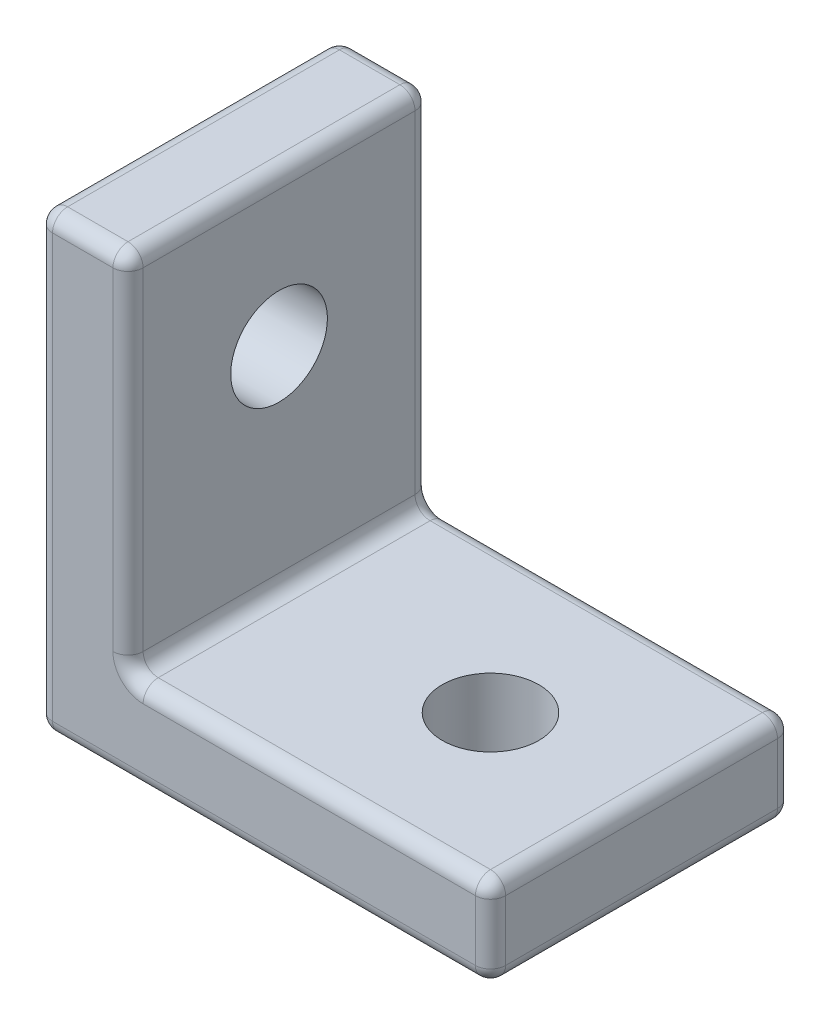
ISO-10303-21;
HEADER;
FILE_DESCRIPTION(('STEP AP214'),'2;1');
FILE_NAME('part.step','',(''),(''),'','','');
FILE_SCHEMA(('AUTOMOTIVE_DESIGN { 1 0 10303 214 1 1 1 1 }'));
ENDSEC;
DATA;
#1=APPLICATION_CONTEXT('core data for automotive mechanical design processes');
#2=APPLICATION_PROTOCOL_DEFINITION('international standard','automotive_design',2000,#1);
#3=PRODUCT_CONTEXT('',#1,'mechanical');
#4=PRODUCT('Part','Part','',(#3));
#5=PRODUCT_RELATED_PRODUCT_CATEGORY('part','',(#4));
#6=PRODUCT_DEFINITION_FORMATION('','',#4);
#7=PRODUCT_DEFINITION_CONTEXT('part definition',#1,'design');
#8=PRODUCT_DEFINITION('design','',#6,#7);
#9=PRODUCT_DEFINITION_SHAPE('','',#8);
#10=(LENGTH_UNIT() NAMED_UNIT(*) SI_UNIT(.MILLI.,.METRE.));
#11=(NAMED_UNIT(*) PLANE_ANGLE_UNIT() SI_UNIT($,.RADIAN.));
#12=(NAMED_UNIT(*) SI_UNIT($,.STERADIAN.) SOLID_ANGLE_UNIT());
#13=UNCERTAINTY_MEASURE_WITH_UNIT(LENGTH_MEASURE(1.E-05),#10,'distance_accuracy_value','');
#14=(GEOMETRIC_REPRESENTATION_CONTEXT(3) GLOBAL_UNCERTAINTY_ASSIGNED_CONTEXT((#13)) GLOBAL_UNIT_ASSIGNED_CONTEXT((#10,
#11,#12)) REPRESENTATION_CONTEXT('',''));
#15=CARTESIAN_POINT('',(0.,0.,0.));
#16=DIRECTION('',(0.,0.,1.));
#17=DIRECTION('',(1.,0.,0.));
#18=AXIS2_PLACEMENT_3D('',#15,#16,#17);
#19=CARTESIAN_POINT('',(3.,15.,10.));
#20=DIRECTION('',(0.,-1.,0.));
#21=DIRECTION('',(0.,0.,-1.));
#22=AXIS2_PLACEMENT_3D('',#19,#20,#21);
#23=PLANE('',#22);
#24=DIRECTION('',(-1.,0.,0.));
#25=VECTOR('',#24,1.);
#26=CARTESIAN_POINT('',(3.,15.,0.5));
#27=LINE('',#26,#25);
#28=CARTESIAN_POINT('',(2.5,15.,0.5));
#29=VERTEX_POINT('',#28);
#30=CARTESIAN_POINT('',(0.499999999999998,15.,0.5));
#31=VERTEX_POINT('',#30);
#32=EDGE_CURVE('E180',#29,#31,#27,.T.);
#33=ORIENTED_EDGE('',*,*,#32,.T.);
#34=DIRECTION('',(0.,0.,-1.));
#35=VECTOR('',#34,1.);
#36=CARTESIAN_POINT('',(0.499999999999998,15.,10.));
#37=LINE('',#36,#35);
#38=CARTESIAN_POINT('',(0.499999999999998,15.,9.5));
#39=VERTEX_POINT('',#38);
#40=EDGE_CURVE('E178',#31,#39,#37,.F.);
#41=ORIENTED_EDGE('',*,*,#40,.T.);
#42=DIRECTION('',(-1.,0.,0.));
#43=VECTOR('',#42,1.);
#44=CARTESIAN_POINT('',(3.,15.,9.5));
#45=LINE('',#44,#43);
#46=CARTESIAN_POINT('',(2.5,15.,9.5));
#47=VERTEX_POINT('',#46);
#48=EDGE_CURVE('E171',#39,#47,#45,.F.);
#49=ORIENTED_EDGE('',*,*,#48,.T.);
#50=DIRECTION('',(0.,0.,-1.));
#51=VECTOR('',#50,1.);
#52=CARTESIAN_POINT('',(2.5,15.,10.));
#53=LINE('',#52,#51);
#54=EDGE_CURVE('E175',#47,#29,#53,.T.);
#55=ORIENTED_EDGE('',*,*,#54,.T.);
#56=EDGE_LOOP('',(#33,#41,#49,#55));
#57=FACE_BOUND('',#56,.T.);
#58=ADVANCED_FACE('F38',(#57),#23,.F.);
#59=CARTESIAN_POINT('',(0.,15.,10.));
#60=DIRECTION('',(1.,0.,0.));
#61=DIRECTION('',(0.,1.,0.));
#62=AXIS2_PLACEMENT_3D('',#59,#60,#61);
#63=PLANE('',#62);
#64=DIRECTION('',(0.,-1.,0.));
#65=VECTOR('',#64,1.);
#66=CARTESIAN_POINT('',(0.,15.,0.5));
#67=LINE('',#66,#65);
#68=CARTESIAN_POINT('',(0.,14.5,0.5));
#69=VERTEX_POINT('',#68);
#70=CARTESIAN_POINT('',(0.,0.5,0.5));
#71=VERTEX_POINT('',#70);
#72=EDGE_CURVE('E234',#69,#71,#67,.T.);
#73=ORIENTED_EDGE('',*,*,#72,.T.);
#74=DIRECTION('',(0.,0.,-1.));
#75=VECTOR('',#74,1.);
#76=CARTESIAN_POINT('',(0.,0.5,10.));
#77=LINE('',#76,#75);
#78=CARTESIAN_POINT('',(0.,0.5,9.5));
#79=VERTEX_POINT('',#78);
#80=EDGE_CURVE('E237',#71,#79,#77,.F.);
#81=ORIENTED_EDGE('',*,*,#80,.T.);
#82=DIRECTION('',(0.,-1.,0.));
#83=VECTOR('',#82,1.);
#84=CARTESIAN_POINT('',(0.,15.,9.5));
#85=LINE('',#84,#83);
#86=CARTESIAN_POINT('',(0.,14.5,9.5));
#87=VERTEX_POINT('',#86);
#88=EDGE_CURVE('E232',#79,#87,#85,.F.);
#89=ORIENTED_EDGE('',*,*,#88,.T.);
#90=DIRECTION('',(0.,0.,-1.));
#91=VECTOR('',#90,1.);
#92=CARTESIAN_POINT('',(0.,14.5,10.));
#93=LINE('',#92,#91);
#94=EDGE_CURVE('E230',#87,#69,#93,.T.);
#95=ORIENTED_EDGE('',*,*,#94,.T.);
#96=EDGE_LOOP('',(#73,#81,#89,#95));
#97=FACE_BOUND('',#96,.T.);
#98=CARTESIAN_POINT('',(0.,10.,5.));
#99=DIRECTION('',(-1.,0.,0.));
#100=DIRECTION('',(0.,-1.,0.));
#101=AXIS2_PLACEMENT_3D('',#98,#99,#100);
#102=CIRCLE('',#101,1.6);
#103=CARTESIAN_POINT('',(0.,8.4,5.));
#104=VERTEX_POINT('',#103);
#105=EDGE_CURVE('E373',#104,#104,#102,.T.);
#106=ORIENTED_EDGE('',*,*,#105,.F.);
#107=EDGE_LOOP('',(#106));
#108=FACE_BOUND('',#107,.T.);
#109=ADVANCED_FACE('F393',(#97,#108),#63,.F.);
#110=CARTESIAN_POINT('',(0.,0.,10.));
#111=DIRECTION('',(0.,1.,0.));
#112=DIRECTION('',(0.,0.,1.));
#113=AXIS2_PLACEMENT_3D('',#110,#111,#112);
#114=PLANE('',#113);
#115=DIRECTION('',(1.,0.,0.));
#116=VECTOR('',#115,1.);
#117=CARTESIAN_POINT('',(0.,0.,0.5));
#118=LINE('',#117,#116);
#119=CARTESIAN_POINT('',(0.5,0.,0.5));
#120=VERTEX_POINT('',#119);
#121=CARTESIAN_POINT('',(14.5,0.,0.5));
#122=VERTEX_POINT('',#121);
#123=EDGE_CURVE('E243',#120,#122,#118,.T.);
#124=ORIENTED_EDGE('',*,*,#123,.T.);
#125=DIRECTION('',(0.,0.,-1.));
#126=VECTOR('',#125,1.);
#127=CARTESIAN_POINT('',(14.5,0.,10.));
#128=LINE('',#127,#126);
#129=CARTESIAN_POINT('',(14.5,0.,9.5));
#130=VERTEX_POINT('',#129);
#131=EDGE_CURVE('E246',#122,#130,#128,.F.);
#132=ORIENTED_EDGE('',*,*,#131,.T.);
#133=DIRECTION('',(1.,0.,0.));
#134=VECTOR('',#133,1.);
#135=CARTESIAN_POINT('',(0.,0.,9.5));
#136=LINE('',#135,#134);
#137=CARTESIAN_POINT('',(0.5,0.,9.5));
#138=VERTEX_POINT('',#137);
#139=EDGE_CURVE('E241',#130,#138,#136,.F.);
#140=ORIENTED_EDGE('',*,*,#139,.T.);
#141=DIRECTION('',(0.,0.,-1.));
#142=VECTOR('',#141,1.);
#143=CARTESIAN_POINT('',(0.5,0.,10.));
#144=LINE('',#143,#142);
#145=EDGE_CURVE('E239',#138,#120,#144,.T.);
#146=ORIENTED_EDGE('',*,*,#145,.T.);
#147=EDGE_LOOP('',(#124,#132,#140,#146));
#148=FACE_BOUND('',#147,.T.);
#149=CARTESIAN_POINT('',(10.,0.,5.));
#150=DIRECTION('',(0.,-1.,0.));
#151=DIRECTION('',(0.,0.,-1.));
#152=AXIS2_PLACEMENT_3D('',#149,#150,#151);
#153=CIRCLE('',#152,1.6);
#154=CARTESIAN_POINT('',(10.,0.,3.4));
#155=VERTEX_POINT('',#154);
#156=EDGE_CURVE('E207',#155,#155,#153,.T.);
#157=ORIENTED_EDGE('',*,*,#156,.F.);
#158=EDGE_LOOP('',(#157));
#159=FACE_BOUND('',#158,.T.);
#160=ADVANCED_FACE('F390',(#148,#159),#114,.F.);
#161=CARTESIAN_POINT('',(15.,0.,10.));
#162=DIRECTION('',(-1.,0.,0.));
#163=DIRECTION('',(0.,0.,1.));
#164=AXIS2_PLACEMENT_3D('',#161,#162,#163);
#165=PLANE('',#164);
#166=DIRECTION('',(0.,1.,0.));
#167=VECTOR('',#166,1.);
#168=CARTESIAN_POINT('',(15.,0.,0.5));
#169=LINE('',#168,#167);
#170=CARTESIAN_POINT('',(15.,0.5,0.5));
#171=VERTEX_POINT('',#170);
#172=CARTESIAN_POINT('',(15.,2.5,0.5));
#173=VERTEX_POINT('',#172);
#174=EDGE_CURVE('E252',#171,#173,#169,.T.);
#175=ORIENTED_EDGE('',*,*,#174,.T.);
#176=DIRECTION('',(0.,0.,-1.));
#177=VECTOR('',#176,1.);
#178=CARTESIAN_POINT('',(15.,2.5,10.));
#179=LINE('',#178,#177);
#180=CARTESIAN_POINT('',(15.,2.5,9.5));
#181=VERTEX_POINT('',#180);
#182=EDGE_CURVE('E255',#173,#181,#179,.F.);
#183=ORIENTED_EDGE('',*,*,#182,.T.);
#184=DIRECTION('',(0.,1.,0.));
#185=VECTOR('',#184,1.);
#186=CARTESIAN_POINT('',(15.,0.,9.5));
#187=LINE('',#186,#185);
#188=CARTESIAN_POINT('',(15.,0.5,9.5));
#189=VERTEX_POINT('',#188);
#190=EDGE_CURVE('E250',#181,#189,#187,.F.);
#191=ORIENTED_EDGE('',*,*,#190,.T.);
#192=DIRECTION('',(0.,0.,-1.));
#193=VECTOR('',#192,1.);
#194=CARTESIAN_POINT('',(15.,0.5,10.));
#195=LINE('',#194,#193);
#196=EDGE_CURVE('E248',#189,#171,#195,.T.);
#197=ORIENTED_EDGE('',*,*,#196,.T.);
#198=EDGE_LOOP('',(#175,#183,#191,#197));
#199=FACE_BOUND('',#198,.T.);
#200=ADVANCED_FACE('F392',(#199),#165,.F.);
#201=CARTESIAN_POINT('',(15.,3.,10.));
#202=DIRECTION('',(0.,-1.,0.));
#203=DIRECTION('',(1.,0.,0.));
#204=AXIS2_PLACEMENT_3D('',#201,#202,#203);
#205=PLANE('',#204);
#206=DIRECTION('',(-1.,0.,0.));
#207=VECTOR('',#206,1.);
#208=CARTESIAN_POINT('',(15.,3.,9.5));
#209=LINE('',#208,#207);
#210=CARTESIAN_POINT('',(3.5,3.,9.5));
#211=VERTEX_POINT('',#210);
#212=CARTESIAN_POINT('',(14.5,3.,9.5));
#213=VERTEX_POINT('',#212);
#214=EDGE_CURVE('E259',#211,#213,#209,.F.);
#215=ORIENTED_EDGE('',*,*,#214,.T.);
#216=DIRECTION('',(0.,0.,-1.));
#217=VECTOR('',#216,1.);
#218=CARTESIAN_POINT('',(14.5,3.,10.));
#219=LINE('',#218,#217);
#220=CARTESIAN_POINT('',(14.5,3.,0.5));
#221=VERTEX_POINT('',#220);
#222=EDGE_CURVE('E264',#213,#221,#219,.T.);
#223=ORIENTED_EDGE('',*,*,#222,.T.);
#224=DIRECTION('',(-1.,0.,0.));
#225=VECTOR('',#224,1.);
#226=CARTESIAN_POINT('',(15.,3.,0.5));
#227=LINE('',#226,#225);
#228=CARTESIAN_POINT('',(3.5,3.,0.5));
#229=VERTEX_POINT('',#228);
#230=EDGE_CURVE('E261',#221,#229,#227,.T.);
#231=ORIENTED_EDGE('',*,*,#230,.T.);
#232=DIRECTION('',(0.,0.,-1.));
#233=VECTOR('',#232,1.);
#234=CARTESIAN_POINT('',(3.5,3.,10.));
#235=LINE('',#234,#233);
#236=EDGE_CURVE('E257',#229,#211,#235,.F.);
#237=ORIENTED_EDGE('',*,*,#236,.T.);
#238=EDGE_LOOP('',(#215,#223,#231,#237));
#239=FACE_BOUND('',#238,.T.);
#240=CARTESIAN_POINT('',(10.,3.,5.));
#241=DIRECTION('',(0.,-1.,0.));
#242=DIRECTION('',(1.,0.,0.));
#243=AXIS2_PLACEMENT_3D('',#240,#241,#242);
#244=CIRCLE('',#243,1.6);
#245=CARTESIAN_POINT('',(11.6,3.,5.));
#246=VERTEX_POINT('',#245);
#247=EDGE_CURVE('E204',#246,#246,#244,.T.);
#248=ORIENTED_EDGE('',*,*,#247,.T.);
#249=EDGE_LOOP('',(#248));
#250=FACE_BOUND('',#249,.T.);
#251=ADVANCED_FACE('F400',(#239,#250),#205,.F.);
#252=CARTESIAN_POINT('',(3.,3.,10.));
#253=DIRECTION('',(-1.,0.,0.));
#254=DIRECTION('',(0.,-1.,0.));
#255=AXIS2_PLACEMENT_3D('',#252,#253,#254);
#256=PLANE('',#255);
#257=DIRECTION('',(0.,1.,0.));
#258=VECTOR('',#257,1.);
#259=CARTESIAN_POINT('',(3.,3.,0.5));
#260=LINE('',#259,#258);
#261=CARTESIAN_POINT('',(3.,3.5,0.5));
#262=VERTEX_POINT('',#261);
#263=CARTESIAN_POINT('',(3.,14.5,0.5));
#264=VERTEX_POINT('',#263);
#265=EDGE_CURVE('E270',#262,#264,#260,.T.);
#266=ORIENTED_EDGE('',*,*,#265,.T.);
#267=DIRECTION('',(0.,0.,-1.));
#268=VECTOR('',#267,1.);
#269=CARTESIAN_POINT('',(3.,14.5,10.));
#270=LINE('',#269,#268);
#271=CARTESIAN_POINT('',(3.,14.5,9.5));
#272=VERTEX_POINT('',#271);
#273=EDGE_CURVE('E273',#264,#272,#270,.F.);
#274=ORIENTED_EDGE('',*,*,#273,.T.);
#275=DIRECTION('',(0.,1.,0.));
#276=VECTOR('',#275,1.);
#277=CARTESIAN_POINT('',(3.,3.,9.5));
#278=LINE('',#277,#276);
#279=CARTESIAN_POINT('',(3.,3.5,9.5));
#280=VERTEX_POINT('',#279);
#281=EDGE_CURVE('E268',#272,#280,#278,.F.);
#282=ORIENTED_EDGE('',*,*,#281,.T.);
#283=DIRECTION('',(0.,0.,-1.));
#284=VECTOR('',#283,1.);
#285=CARTESIAN_POINT('',(3.,3.5,0.));
#286=LINE('',#285,#284);
#287=EDGE_CURVE('E266',#280,#262,#286,.T.);
#288=ORIENTED_EDGE('',*,*,#287,.T.);
#289=EDGE_LOOP('',(#266,#274,#282,#288));
#290=FACE_BOUND('',#289,.T.);
#291=CARTESIAN_POINT('',(3.,10.,5.));
#292=DIRECTION('',(-1.,0.,0.));
#293=DIRECTION('',(0.,-1.,0.));
#294=AXIS2_PLACEMENT_3D('',#291,#292,#293);
#295=CIRCLE('',#294,1.6);
#296=CARTESIAN_POINT('',(3.,8.4,5.));
#297=VERTEX_POINT('',#296);
#298=EDGE_CURVE('E210',#297,#297,#295,.T.);
#299=ORIENTED_EDGE('',*,*,#298,.T.);
#300=EDGE_LOOP('',(#299));
#301=FACE_BOUND('',#300,.T.);
#302=ADVANCED_FACE('F542',(#290,#301),#256,.F.);
#303=CARTESIAN_POINT('',(0.,0.,10.));
#304=DIRECTION('',(0.,0.,1.));
#305=DIRECTION('',(1.,0.,0.));
#306=AXIS2_PLACEMENT_3D('',#303,#304,#305);
#307=PLANE('',#306);
#308=DIRECTION('',(0.,1.,0.));
#309=VECTOR('',#308,1.);
#310=CARTESIAN_POINT('',(2.5,15.,10.));
#311=LINE('',#310,#309);
#312=CARTESIAN_POINT('',(2.5,3.5,10.));
#313=VERTEX_POINT('',#312);
#314=CARTESIAN_POINT('',(2.5,14.5,10.));
#315=VERTEX_POINT('',#314);
#316=EDGE_CURVE('E275',#313,#315,#311,.T.);
#317=ORIENTED_EDGE('',*,*,#316,.T.);
#318=DIRECTION('',(-1.,0.,0.));
#319=VECTOR('',#318,1.);
#320=CARTESIAN_POINT('',(0.,14.5,10.));
#321=LINE('',#320,#319);
#322=CARTESIAN_POINT('',(0.499999999999998,14.5,10.));
#323=VERTEX_POINT('',#322);
#324=EDGE_CURVE('E11',#315,#323,#321,.T.);
#325=ORIENTED_EDGE('',*,*,#324,.T.);
#326=DIRECTION('',(0.,-1.,0.));
#327=VECTOR('',#326,1.);
#328=CARTESIAN_POINT('',(0.5,0.,10.));
#329=LINE('',#328,#327);
#330=CARTESIAN_POINT('',(0.5,0.5,10.));
#331=VERTEX_POINT('',#330);
#332=EDGE_CURVE('E47',#323,#331,#329,.T.);
#333=ORIENTED_EDGE('',*,*,#332,.T.);
#334=DIRECTION('',(1.,0.,0.));
#335=VECTOR('',#334,1.);
#336=CARTESIAN_POINT('',(15.,0.5,10.));
#337=LINE('',#336,#335);
#338=CARTESIAN_POINT('',(14.5,0.5,10.));
#339=VERTEX_POINT('',#338);
#340=EDGE_CURVE('E284',#331,#339,#337,.T.);
#341=ORIENTED_EDGE('',*,*,#340,.T.);
#342=DIRECTION('',(0.,1.,0.));
#343=VECTOR('',#342,1.);
#344=CARTESIAN_POINT('',(14.5,3.,10.));
#345=LINE('',#344,#343);
#346=CARTESIAN_POINT('',(14.5,2.5,10.));
#347=VERTEX_POINT('',#346);
#348=EDGE_CURVE('E282',#339,#347,#345,.T.);
#349=ORIENTED_EDGE('',*,*,#348,.T.);
#350=DIRECTION('',(-1.,0.,0.));
#351=VECTOR('',#350,1.);
#352=CARTESIAN_POINT('',(3.,2.5,10.));
#353=LINE('',#352,#351);
#354=CARTESIAN_POINT('',(3.5,2.5,10.));
#355=VERTEX_POINT('',#354);
#356=EDGE_CURVE('E280',#347,#355,#353,.T.);
#357=ORIENTED_EDGE('',*,*,#356,.T.);
#358=CARTESIAN_POINT('',(3.5,3.5,10.));
#359=DIRECTION('',(0.,0.,1.));
#360=DIRECTION('',(1.,0.,0.));
#361=AXIS2_PLACEMENT_3D('',#358,#359,#360);
#362=CIRCLE('',#361,1.);
#363=EDGE_CURVE('E277',#313,#355,#362,.T.);
#364=ORIENTED_EDGE('',*,*,#363,.F.);
#365=EDGE_LOOP('',(#317,#325,#333,#341,#349,#357,#364));
#366=FACE_BOUND('',#365,.T.);
#367=ADVANCED_FACE('F524',(#366),#307,.T.);
#368=CARTESIAN_POINT('',(0.,0.,0.));
#369=DIRECTION('',(0.,0.,1.));
#370=DIRECTION('',(1.,0.,0.));
#371=AXIS2_PLACEMENT_3D('',#368,#369,#370);
#372=PLANE('',#371);
#373=DIRECTION('',(0.,-1.,0.));
#374=VECTOR('',#373,1.);
#375=CARTESIAN_POINT('',(0.5,0.,0.));
#376=LINE('',#375,#374);
#377=CARTESIAN_POINT('',(0.5,0.5,0.));
#378=VERTEX_POINT('',#377);
#379=CARTESIAN_POINT('',(0.499999999999998,14.5,0.));
#380=VERTEX_POINT('',#379);
#381=EDGE_CURVE('E225',#378,#380,#376,.F.);
#382=ORIENTED_EDGE('',*,*,#381,.T.);
#383=DIRECTION('',(-1.,0.,0.));
#384=VECTOR('',#383,1.);
#385=CARTESIAN_POINT('',(0.,14.5,0.));
#386=LINE('',#385,#384);
#387=CARTESIAN_POINT('',(2.5,14.5,0.));
#388=VERTEX_POINT('',#387);
#389=EDGE_CURVE('E227',#380,#388,#386,.F.);
#390=ORIENTED_EDGE('',*,*,#389,.T.);
#391=DIRECTION('',(0.,1.,0.));
#392=VECTOR('',#391,1.);
#393=CARTESIAN_POINT('',(2.5,0.,0.));
#394=LINE('',#393,#392);
#395=CARTESIAN_POINT('',(2.5,3.5,0.));
#396=VERTEX_POINT('',#395);
#397=EDGE_CURVE('E217',#388,#396,#394,.F.);
#398=ORIENTED_EDGE('',*,*,#397,.T.);
#399=CARTESIAN_POINT('',(3.5,3.5,0.));
#400=DIRECTION('',(0.,0.,1.));
#401=DIRECTION('',(1.,0.,0.));
#402=AXIS2_PLACEMENT_3D('',#399,#400,#401);
#403=CIRCLE('',#402,1.);
#404=CARTESIAN_POINT('',(3.5,2.5,0.));
#405=VERTEX_POINT('',#404);
#406=EDGE_CURVE('E214',#405,#396,#403,.F.);
#407=ORIENTED_EDGE('',*,*,#406,.F.);
#408=DIRECTION('',(-1.,0.,0.));
#409=VECTOR('',#408,1.);
#410=CARTESIAN_POINT('',(0.,2.5,0.));
#411=LINE('',#410,#409);
#412=CARTESIAN_POINT('',(14.5,2.5,0.));
#413=VERTEX_POINT('',#412);
#414=EDGE_CURVE('E219',#405,#413,#411,.F.);
#415=ORIENTED_EDGE('',*,*,#414,.T.);
#416=DIRECTION('',(0.,1.,0.));
#417=VECTOR('',#416,1.);
#418=CARTESIAN_POINT('',(14.5,0.,0.));
#419=LINE('',#418,#417);
#420=CARTESIAN_POINT('',(14.5,0.5,0.));
#421=VERTEX_POINT('',#420);
#422=EDGE_CURVE('E221',#413,#421,#419,.F.);
#423=ORIENTED_EDGE('',*,*,#422,.T.);
#424=DIRECTION('',(1.,0.,0.));
#425=VECTOR('',#424,1.);
#426=CARTESIAN_POINT('',(0.,0.5,0.));
#427=LINE('',#426,#425);
#428=EDGE_CURVE('E223',#421,#378,#427,.F.);
#429=ORIENTED_EDGE('',*,*,#428,.T.);
#430=EDGE_LOOP('',(#382,#390,#398,#407,#415,#423,#429));
#431=FACE_BOUND('',#430,.T.);
#432=ADVANCED_FACE('F571',(#431),#372,.F.);
#433=CARTESIAN_POINT('',(10.,5.,5.));
#434=DIRECTION('',(0.,-1.,0.));
#435=DIRECTION('',(0.,0.,-1.));
#436=AXIS2_PLACEMENT_3D('',#433,#434,#435);
#437=CYLINDRICAL_SURFACE('',#436,1.6);
#438=ORIENTED_EDGE('',*,*,#156,.T.);
#439=EDGE_LOOP('',(#438));
#440=FACE_BOUND('',#439,.T.);
#441=ORIENTED_EDGE('',*,*,#247,.F.);
#442=EDGE_LOOP('',(#441));
#443=FACE_BOUND('',#442,.T.);
#444=ADVANCED_FACE('F387',(#440,#443),#437,.F.);
#445=CARTESIAN_POINT('',(5.,10.,5.));
#446=DIRECTION('',(-1.,0.,0.));
#447=DIRECTION('',(0.,-1.,0.));
#448=AXIS2_PLACEMENT_3D('',#445,#446,#447);
#449=CYLINDRICAL_SURFACE('',#448,1.6);
#450=ORIENTED_EDGE('',*,*,#105,.T.);
#451=EDGE_LOOP('',(#450));
#452=FACE_BOUND('',#451,.T.);
#453=ORIENTED_EDGE('',*,*,#298,.F.);
#454=EDGE_LOOP('',(#453));
#455=FACE_BOUND('',#454,.T.);
#456=ADVANCED_FACE('F518',(#452,#455),#449,.F.);
#457=CARTESIAN_POINT('',(14.5,0.,9.5));
#458=DIRECTION('',(0.,-1.,0.));
#459=DIRECTION('',(0.,0.,-1.));
#460=AXIS2_PLACEMENT_3D('',#457,#458,#459);
#461=CYLINDRICAL_SURFACE('',#460,0.5);
#462=CARTESIAN_POINT('',(14.5,2.5,9.5));
#463=DIRECTION('',(0.,1.,0.));
#464=DIRECTION('',(0.,0.,1.));
#465=AXIS2_PLACEMENT_3D('',#462,#463,#464);
#466=CIRCLE('',#465,0.5);
#467=EDGE_CURVE('E42',#347,#181,#466,.T.);
#468=ORIENTED_EDGE('',*,*,#467,.F.);
#469=ORIENTED_EDGE('',*,*,#348,.F.);
#470=CARTESIAN_POINT('',(14.5,0.5,9.5));
#471=DIRECTION('',(0.,-1.,0.));
#472=DIRECTION('',(0.,0.,-1.));
#473=AXIS2_PLACEMENT_3D('',#470,#471,#472);
#474=CIRCLE('',#473,0.5);
#475=EDGE_CURVE('E366',#189,#339,#474,.T.);
#476=ORIENTED_EDGE('',*,*,#475,.F.);
#477=ORIENTED_EDGE('',*,*,#190,.F.);
#478=EDGE_LOOP('',(#468,#469,#476,#477));
#479=FACE_BOUND('',#478,.T.);
#480=ADVANCED_FACE('F40',(#479),#461,.T.);
#481=CARTESIAN_POINT('',(14.5,2.5,9.5));
#482=DIRECTION('',(1.,0.,0.));
#483=DIRECTION('',(0.,0.,-1.));
#484=AXIS2_PLACEMENT_3D('',#481,#482,#483);
#485=SPHERICAL_SURFACE('',#484,0.5);
#486=CARTESIAN_POINT('',(14.5,2.5,9.5));
#487=DIRECTION('',(1.,0.,0.));
#488=DIRECTION('',(0.,0.,-1.));
#489=AXIS2_PLACEMENT_3D('',#486,#487,#488);
#490=CIRCLE('',#489,0.5);
#491=EDGE_CURVE('E361',#347,#213,#490,.F.);
#492=ORIENTED_EDGE('',*,*,#491,.F.);
#493=ORIENTED_EDGE('',*,*,#467,.T.);
#494=CARTESIAN_POINT('',(14.5,2.5,9.5));
#495=DIRECTION('',(0.,0.,1.));
#496=DIRECTION('',(1.,0.,0.));
#497=AXIS2_PLACEMENT_3D('',#494,#495,#496);
#498=CIRCLE('',#497,0.5);
#499=EDGE_CURVE('E364',#213,#181,#498,.F.);
#500=ORIENTED_EDGE('',*,*,#499,.F.);
#501=EDGE_LOOP('',(#492,#493,#500));
#502=FACE_BOUND('',#501,.T.);
#503=ADVANCED_FACE('F513',(#502),#485,.T.);
#504=CARTESIAN_POINT('',(14.5,0.5,9.5));
#505=DIRECTION('',(0.,0.,1.));
#506=DIRECTION('',(1.,0.,0.));
#507=AXIS2_PLACEMENT_3D('',#504,#505,#506);
#508=SPHERICAL_SURFACE('',#507,0.5);
#509=CARTESIAN_POINT('',(14.5,0.5,9.5));
#510=DIRECTION('',(0.,0.,1.));
#511=DIRECTION('',(1.,0.,0.));
#512=AXIS2_PLACEMENT_3D('',#509,#510,#511);
#513=CIRCLE('',#512,0.5);
#514=EDGE_CURVE('E355',#189,#130,#513,.F.);
#515=ORIENTED_EDGE('',*,*,#514,.F.);
#516=ORIENTED_EDGE('',*,*,#475,.T.);
#517=CARTESIAN_POINT('',(14.5,0.5,9.5));
#518=DIRECTION('',(1.,0.,0.));
#519=DIRECTION('',(0.,0.,-1.));
#520=AXIS2_PLACEMENT_3D('',#517,#518,#519);
#521=CIRCLE('',#520,0.5);
#522=EDGE_CURVE('E358',#130,#339,#521,.F.);
#523=ORIENTED_EDGE('',*,*,#522,.F.);
#524=EDGE_LOOP('',(#515,#516,#523));
#525=FACE_BOUND('',#524,.T.);
#526=ADVANCED_FACE('F510',(#525),#508,.T.);
#527=CARTESIAN_POINT('',(14.5,2.5,10.));
#528=DIRECTION('',(0.,0.,-1.));
#529=DIRECTION('',(-1.,0.,0.));
#530=AXIS2_PLACEMENT_3D('',#527,#528,#529);
#531=CYLINDRICAL_SURFACE('',#530,0.5);
#532=ORIENTED_EDGE('',*,*,#499,.T.);
#533=ORIENTED_EDGE('',*,*,#182,.F.);
#534=CARTESIAN_POINT('',(14.5,2.5,0.5));
#535=DIRECTION('',(0.,0.,-1.));
#536=DIRECTION('',(-1.,0.,0.));
#537=AXIS2_PLACEMENT_3D('',#534,#535,#536);
#538=CIRCLE('',#537,0.5);
#539=EDGE_CURVE('E350',#221,#173,#538,.T.);
#540=ORIENTED_EDGE('',*,*,#539,.F.);
#541=ORIENTED_EDGE('',*,*,#222,.F.);
#542=EDGE_LOOP('',(#532,#533,#540,#541));
#543=FACE_BOUND('',#542,.T.);
#544=ADVANCED_FACE('F506',(#543),#531,.T.);
#545=CARTESIAN_POINT('',(0.,2.5,9.5));
#546=DIRECTION('',(1.,0.,0.));
#547=DIRECTION('',(0.,1.,0.));
#548=AXIS2_PLACEMENT_3D('',#545,#546,#547);
#549=CYLINDRICAL_SURFACE('',#548,0.5);
#550=ORIENTED_EDGE('',*,*,#491,.T.);
#551=ORIENTED_EDGE('',*,*,#214,.F.);
#552=CARTESIAN_POINT('',(3.5,2.5,9.5));
#553=DIRECTION('',(-1.,0.,0.));
#554=DIRECTION('',(0.,0.,1.));
#555=AXIS2_PLACEMENT_3D('',#552,#553,#554);
#556=CIRCLE('',#555,0.5);
#557=EDGE_CURVE('E347',#355,#211,#556,.T.);
#558=ORIENTED_EDGE('',*,*,#557,.F.);
#559=ORIENTED_EDGE('',*,*,#356,.F.);
#560=EDGE_LOOP('',(#550,#551,#558,#559));
#561=FACE_BOUND('',#560,.T.);
#562=ADVANCED_FACE('F502',(#561),#549,.T.);
#563=CARTESIAN_POINT('',(0.,0.5,9.5));
#564=DIRECTION('',(-1.,0.,0.));
#565=DIRECTION('',(0.,0.,1.));
#566=AXIS2_PLACEMENT_3D('',#563,#564,#565);
#567=CYLINDRICAL_SURFACE('',#566,0.5);
#568=ORIENTED_EDGE('',*,*,#522,.T.);
#569=ORIENTED_EDGE('',*,*,#340,.F.);
#570=CARTESIAN_POINT('',(0.5,0.5,9.5));
#571=DIRECTION('',(-1.,0.,0.));
#572=DIRECTION('',(0.,0.,1.));
#573=AXIS2_PLACEMENT_3D('',#570,#571,#572);
#574=CIRCLE('',#573,0.5);
#575=EDGE_CURVE('E344',#138,#331,#574,.T.);
#576=ORIENTED_EDGE('',*,*,#575,.F.);
#577=ORIENTED_EDGE('',*,*,#139,.F.);
#578=EDGE_LOOP('',(#568,#569,#576,#577));
#579=FACE_BOUND('',#578,.T.);
#580=ADVANCED_FACE('F498',(#579),#567,.T.);
#581=CARTESIAN_POINT('',(14.5,0.5,10.));
#582=DIRECTION('',(0.,0.,-1.));
#583=DIRECTION('',(-1.,0.,0.));
#584=AXIS2_PLACEMENT_3D('',#581,#582,#583);
#585=CYLINDRICAL_SURFACE('',#584,0.5);
#586=ORIENTED_EDGE('',*,*,#514,.T.);
#587=ORIENTED_EDGE('',*,*,#131,.F.);
#588=CARTESIAN_POINT('',(14.5,0.5,0.5));
#589=DIRECTION('',(0.,0.,-1.));
#590=DIRECTION('',(-1.,0.,0.));
#591=AXIS2_PLACEMENT_3D('',#588,#589,#590);
#592=CIRCLE('',#591,0.5);
#593=EDGE_CURVE('E341',#171,#122,#592,.T.);
#594=ORIENTED_EDGE('',*,*,#593,.F.);
#595=ORIENTED_EDGE('',*,*,#196,.F.);
#596=EDGE_LOOP('',(#586,#587,#594,#595));
#597=FACE_BOUND('',#596,.T.);
#598=ADVANCED_FACE('F494',(#597),#585,.T.);
#599=CARTESIAN_POINT('',(14.5,0.,0.5));
#600=DIRECTION('',(0.,1.,0.));
#601=DIRECTION('',(0.,0.,1.));
#602=AXIS2_PLACEMENT_3D('',#599,#600,#601);
#603=CYLINDRICAL_SURFACE('',#602,0.5);
#604=CARTESIAN_POINT('',(14.5,2.5,0.5));
#605=DIRECTION('',(0.,1.,0.));
#606=DIRECTION('',(0.,0.,1.));
#607=AXIS2_PLACEMENT_3D('',#604,#605,#606);
#608=CIRCLE('',#607,0.5);
#609=EDGE_CURVE('E352',#173,#413,#608,.T.);
#610=ORIENTED_EDGE('',*,*,#609,.F.);
#611=ORIENTED_EDGE('',*,*,#174,.F.);
#612=CARTESIAN_POINT('',(14.5,0.5,0.5));
#613=DIRECTION('',(0.,-1.,0.));
#614=DIRECTION('',(0.,0.,-1.));
#615=AXIS2_PLACEMENT_3D('',#612,#613,#614);
#616=CIRCLE('',#615,0.5);
#617=EDGE_CURVE('E338',#421,#171,#616,.T.);
#618=ORIENTED_EDGE('',*,*,#617,.F.);
#619=ORIENTED_EDGE('',*,*,#422,.F.);
#620=EDGE_LOOP('',(#610,#611,#618,#619));
#621=FACE_BOUND('',#620,.T.);
#622=ADVANCED_FACE('F490',(#621),#603,.T.);
#623=CARTESIAN_POINT('',(14.5,2.5,0.5));
#624=DIRECTION('',(1.,0.,0.));
#625=DIRECTION('',(0.,0.,-1.));
#626=AXIS2_PLACEMENT_3D('',#623,#624,#625);
#627=SPHERICAL_SURFACE('',#626,0.5);
#628=ORIENTED_EDGE('',*,*,#539,.T.);
#629=ORIENTED_EDGE('',*,*,#609,.T.);
#630=CARTESIAN_POINT('',(14.5,2.5,0.5));
#631=DIRECTION('',(1.,0.,0.));
#632=DIRECTION('',(0.,0.,-1.));
#633=AXIS2_PLACEMENT_3D('',#630,#631,#632);
#634=CIRCLE('',#633,0.5);
#635=EDGE_CURVE('E335',#221,#413,#634,.F.);
#636=ORIENTED_EDGE('',*,*,#635,.F.);
#637=EDGE_LOOP('',(#628,#629,#636));
#638=FACE_BOUND('',#637,.T.);
#639=ADVANCED_FACE('F486',(#638),#627,.T.);
#640=CARTESIAN_POINT('',(3.5,3.5,9.5));
#641=DIRECTION('',(0.,0.,1.));
#642=DIRECTION('',(1.,0.,0.));
#643=AXIS2_PLACEMENT_3D('',#640,#641,#642);
#644=TOROIDAL_SURFACE('',#643,1.,0.5);
#645=ORIENTED_EDGE('',*,*,#363,.T.);
#646=ORIENTED_EDGE('',*,*,#557,.T.);
#647=CARTESIAN_POINT('',(3.5,3.5,9.5));
#648=DIRECTION('',(0.,0.,1.));
#649=DIRECTION('',(1.,0.,0.));
#650=AXIS2_PLACEMENT_3D('',#647,#648,#649);
#651=CIRCLE('',#650,0.5);
#652=EDGE_CURVE('E332',#280,#211,#651,.T.);
#653=ORIENTED_EDGE('',*,*,#652,.F.);
#654=CARTESIAN_POINT('',(2.5,3.5,9.5));
#655=DIRECTION('',(0.,-1.,0.));
#656=DIRECTION('',(0.,0.,-1.));
#657=AXIS2_PLACEMENT_3D('',#654,#655,#656);
#658=CIRCLE('',#657,0.5);
#659=EDGE_CURVE('E329',#313,#280,#658,.F.);
#660=ORIENTED_EDGE('',*,*,#659,.F.);
#661=EDGE_LOOP('',(#645,#646,#653,#660));
#662=FACE_BOUND('',#661,.T.);
#663=ADVANCED_FACE('F482',(#662),#644,.T.);
#664=CARTESIAN_POINT('',(0.5,0.5,9.5));
#665=DIRECTION('',(0.,0.,1.));
#666=DIRECTION('',(1.,0.,0.));
#667=AXIS2_PLACEMENT_3D('',#664,#665,#666);
#668=SPHERICAL_SURFACE('',#667,0.5);
#669=CARTESIAN_POINT('',(0.5,0.5,9.5));
#670=DIRECTION('',(0.,0.,1.));
#671=DIRECTION('',(1.,0.,0.));
#672=AXIS2_PLACEMENT_3D('',#669,#670,#671);
#673=CIRCLE('',#672,0.5);
#674=EDGE_CURVE('E323',#138,#79,#673,.F.);
#675=ORIENTED_EDGE('',*,*,#674,.F.);
#676=ORIENTED_EDGE('',*,*,#575,.T.);
#677=CARTESIAN_POINT('',(0.5,0.5,9.5));
#678=DIRECTION('',(0.,-1.,0.));
#679=DIRECTION('',(1.,0.,0.));
#680=AXIS2_PLACEMENT_3D('',#677,#678,#679);
#681=CIRCLE('',#680,0.5);
#682=EDGE_CURVE('E326',#79,#331,#681,.F.);
#683=ORIENTED_EDGE('',*,*,#682,.F.);
#684=EDGE_LOOP('',(#675,#676,#683));
#685=FACE_BOUND('',#684,.T.);
#686=ADVANCED_FACE('F478',(#685),#668,.T.);
#687=CARTESIAN_POINT('',(14.5,0.5,0.5));
#688=DIRECTION('',(1.,0.,0.));
#689=DIRECTION('',(0.,0.,-1.));
#690=AXIS2_PLACEMENT_3D('',#687,#688,#689);
#691=SPHERICAL_SURFACE('',#690,0.5);
#692=ORIENTED_EDGE('',*,*,#617,.T.);
#693=ORIENTED_EDGE('',*,*,#593,.T.);
#694=CARTESIAN_POINT('',(14.5,0.5,0.5));
#695=DIRECTION('',(1.,0.,0.));
#696=DIRECTION('',(0.,0.,-1.));
#697=AXIS2_PLACEMENT_3D('',#694,#695,#696);
#698=CIRCLE('',#697,0.5);
#699=EDGE_CURVE('E321',#421,#122,#698,.F.);
#700=ORIENTED_EDGE('',*,*,#699,.F.);
#701=EDGE_LOOP('',(#692,#693,#700));
#702=FACE_BOUND('',#701,.T.);
#703=ADVANCED_FACE('F474',(#702),#691,.T.);
#704=CARTESIAN_POINT('',(15.,2.5,0.5));
#705=DIRECTION('',(-1.,0.,0.));
#706=DIRECTION('',(0.,-1.,0.));
#707=AXIS2_PLACEMENT_3D('',#704,#705,#706);
#708=CYLINDRICAL_SURFACE('',#707,0.5);
#709=ORIENTED_EDGE('',*,*,#635,.T.);
#710=ORIENTED_EDGE('',*,*,#414,.F.);
#711=CARTESIAN_POINT('',(3.5,2.5,0.5));
#712=DIRECTION('',(-1.,0.,0.));
#713=DIRECTION('',(0.,0.,1.));
#714=AXIS2_PLACEMENT_3D('',#711,#712,#713);
#715=CIRCLE('',#714,0.5);
#716=EDGE_CURVE('E318',#229,#405,#715,.T.);
#717=ORIENTED_EDGE('',*,*,#716,.F.);
#718=ORIENTED_EDGE('',*,*,#230,.F.);
#719=EDGE_LOOP('',(#709,#710,#717,#718));
#720=FACE_BOUND('',#719,.T.);
#721=ADVANCED_FACE('F470',(#720),#708,.T.);
#722=CARTESIAN_POINT('',(3.5,3.5,10.));
#723=DIRECTION('',(0.,0.,1.));
#724=DIRECTION('',(1.,0.,0.));
#725=AXIS2_PLACEMENT_3D('',#722,#723,#724);
#726=CYLINDRICAL_SURFACE('',#725,0.5);
#727=ORIENTED_EDGE('',*,*,#652,.T.);
#728=ORIENTED_EDGE('',*,*,#236,.F.);
#729=CARTESIAN_POINT('',(3.5,3.5,0.5));
#730=DIRECTION('',(0.,0.,1.));
#731=DIRECTION('',(1.,0.,0.));
#732=AXIS2_PLACEMENT_3D('',#729,#730,#731);
#733=CIRCLE('',#732,0.5);
#734=EDGE_CURVE('E316',#262,#229,#733,.T.);
#735=ORIENTED_EDGE('',*,*,#734,.F.);
#736=ORIENTED_EDGE('',*,*,#287,.F.);
#737=EDGE_LOOP('',(#727,#728,#735,#736));
#738=FACE_BOUND('',#737,.T.);
#739=ADVANCED_FACE('F466',(#738),#726,.F.);
#740=CARTESIAN_POINT('',(2.5,0.,9.5));
#741=DIRECTION('',(0.,-1.,0.));
#742=DIRECTION('',(1.,0.,0.));
#743=AXIS2_PLACEMENT_3D('',#740,#741,#742);
#744=CYLINDRICAL_SURFACE('',#743,0.5);
#745=ORIENTED_EDGE('',*,*,#659,.T.);
#746=ORIENTED_EDGE('',*,*,#281,.F.);
#747=CARTESIAN_POINT('',(2.5,14.5,9.5));
#748=DIRECTION('',(0.,1.,0.));
#749=DIRECTION('',(0.,0.,1.));
#750=AXIS2_PLACEMENT_3D('',#747,#748,#749);
#751=CIRCLE('',#750,0.5);
#752=EDGE_CURVE('E190',#315,#272,#751,.T.);
#753=ORIENTED_EDGE('',*,*,#752,.F.);
#754=ORIENTED_EDGE('',*,*,#316,.F.);
#755=EDGE_LOOP('',(#745,#746,#753,#754));
#756=FACE_BOUND('',#755,.T.);
#757=ADVANCED_FACE('F463',(#756),#744,.T.);
#758=CARTESIAN_POINT('',(0.,14.5,9.5));
#759=DIRECTION('',(1.,0.,0.));
#760=DIRECTION('',(0.,0.,-1.));
#761=AXIS2_PLACEMENT_3D('',#758,#759,#760);
#762=CYLINDRICAL_SURFACE('',#761,0.5);
#763=CARTESIAN_POINT('',(0.499999999999998,14.5,9.5));
#764=DIRECTION('',(-1.,0.,0.));
#765=DIRECTION('',(0.,0.,1.));
#766=AXIS2_PLACEMENT_3D('',#763,#764,#765);
#767=CIRCLE('',#766,0.5);
#768=EDGE_CURVE('E191',#323,#39,#767,.T.);
#769=ORIENTED_EDGE('',*,*,#768,.F.);
#770=ORIENTED_EDGE('',*,*,#324,.F.);
#771=CARTESIAN_POINT('',(2.5,14.5,9.5));
#772=DIRECTION('',(1.,0.,0.));
#773=DIRECTION('',(0.,0.,-1.));
#774=AXIS2_PLACEMENT_3D('',#771,#772,#773);
#775=CIRCLE('',#774,0.5);
#776=EDGE_CURVE('E184',#47,#315,#775,.T.);
#777=ORIENTED_EDGE('',*,*,#776,.F.);
#778=ORIENTED_EDGE('',*,*,#48,.F.);
#779=EDGE_LOOP('',(#769,#770,#777,#778));
#780=FACE_BOUND('',#779,.T.);
#781=ADVANCED_FACE('F186',(#780),#762,.T.);
#782=CARTESIAN_POINT('',(0.5,0.,9.5));
#783=DIRECTION('',(0.,1.,0.));
#784=DIRECTION('',(-1.,0.,0.));
#785=AXIS2_PLACEMENT_3D('',#782,#783,#784);
#786=CYLINDRICAL_SURFACE('',#785,0.5);
#787=ORIENTED_EDGE('',*,*,#682,.T.);
#788=ORIENTED_EDGE('',*,*,#332,.F.);
#789=CARTESIAN_POINT('',(0.499999999999998,14.5,9.5));
#790=DIRECTION('',(0.,1.,0.));
#791=DIRECTION('',(0.,0.,1.));
#792=AXIS2_PLACEMENT_3D('',#789,#790,#791);
#793=CIRCLE('',#792,0.5);
#794=EDGE_CURVE('E55',#87,#323,#793,.T.);
#795=ORIENTED_EDGE('',*,*,#794,.F.);
#796=ORIENTED_EDGE('',*,*,#88,.F.);
#797=EDGE_LOOP('',(#787,#788,#795,#796));
#798=FACE_BOUND('',#797,.T.);
#799=ADVANCED_FACE('F456',(#798),#786,.T.);
#800=CARTESIAN_POINT('',(0.5,0.5,10.));
#801=DIRECTION('',(0.,0.,-1.));
#802=DIRECTION('',(-1.,0.,0.));
#803=AXIS2_PLACEMENT_3D('',#800,#801,#802);
#804=CYLINDRICAL_SURFACE('',#803,0.5);
#805=ORIENTED_EDGE('',*,*,#674,.T.);
#806=ORIENTED_EDGE('',*,*,#80,.F.);
#807=CARTESIAN_POINT('',(0.5,0.5,0.5));
#808=DIRECTION('',(0.,0.,-1.));
#809=DIRECTION('',(-1.,0.,0.));
#810=AXIS2_PLACEMENT_3D('',#807,#808,#809);
#811=CIRCLE('',#810,0.5);
#812=EDGE_CURVE('E310',#120,#71,#811,.T.);
#813=ORIENTED_EDGE('',*,*,#812,.F.);
#814=ORIENTED_EDGE('',*,*,#145,.F.);
#815=EDGE_LOOP('',(#805,#806,#813,#814));
#816=FACE_BOUND('',#815,.T.);
#817=ADVANCED_FACE('F452',(#816),#804,.T.);
#818=CARTESIAN_POINT('',(0.,0.5,0.5));
#819=DIRECTION('',(1.,0.,0.));
#820=DIRECTION('',(0.,0.,-1.));
#821=AXIS2_PLACEMENT_3D('',#818,#819,#820);
#822=CYLINDRICAL_SURFACE('',#821,0.5);
#823=ORIENTED_EDGE('',*,*,#699,.T.);
#824=ORIENTED_EDGE('',*,*,#123,.F.);
#825=CARTESIAN_POINT('',(0.5,0.5,0.5));
#826=DIRECTION('',(-1.,0.,0.));
#827=DIRECTION('',(0.,0.,1.));
#828=AXIS2_PLACEMENT_3D('',#825,#826,#827);
#829=CIRCLE('',#828,0.5);
#830=EDGE_CURVE('E307',#378,#120,#829,.T.);
#831=ORIENTED_EDGE('',*,*,#830,.F.);
#832=ORIENTED_EDGE('',*,*,#428,.F.);
#833=EDGE_LOOP('',(#823,#824,#831,#832));
#834=FACE_BOUND('',#833,.T.);
#835=ADVANCED_FACE('F448',(#834),#822,.T.);
#836=CARTESIAN_POINT('',(3.5,3.5,0.5));
#837=DIRECTION('',(0.,0.,1.));
#838=DIRECTION('',(1.,0.,0.));
#839=AXIS2_PLACEMENT_3D('',#836,#837,#838);
#840=TOROIDAL_SURFACE('',#839,1.,0.5);
#841=ORIENTED_EDGE('',*,*,#716,.T.);
#842=ORIENTED_EDGE('',*,*,#406,.T.);
#843=CARTESIAN_POINT('',(2.5,3.5,0.5));
#844=DIRECTION('',(0.,-1.,0.));
#845=DIRECTION('',(0.,0.,-1.));
#846=AXIS2_PLACEMENT_3D('',#843,#844,#845);
#847=CIRCLE('',#846,0.5);
#848=EDGE_CURVE('E198',#262,#396,#847,.F.);
#849=ORIENTED_EDGE('',*,*,#848,.F.);
#850=ORIENTED_EDGE('',*,*,#734,.T.);
#851=EDGE_LOOP('',(#841,#842,#849,#850));
#852=FACE_BOUND('',#851,.T.);
#853=ADVANCED_FACE('F445',(#852),#840,.T.);
#854=CARTESIAN_POINT('',(2.5,14.5,9.5));
#855=DIRECTION('',(0.,0.,1.));
#856=DIRECTION('',(1.,0.,0.));
#857=AXIS2_PLACEMENT_3D('',#854,#855,#856);
#858=SPHERICAL_SURFACE('',#857,0.5);
#859=ORIENTED_EDGE('',*,*,#776,.T.);
#860=ORIENTED_EDGE('',*,*,#752,.T.);
#861=CARTESIAN_POINT('',(2.5,14.5,9.5));
#862=DIRECTION('',(0.,0.,1.));
#863=DIRECTION('',(1.,0.,0.));
#864=AXIS2_PLACEMENT_3D('',#861,#862,#863);
#865=CIRCLE('',#864,0.5);
#866=EDGE_CURVE('E194',#47,#272,#865,.F.);
#867=ORIENTED_EDGE('',*,*,#866,.F.);
#868=EDGE_LOOP('',(#859,#860,#867));
#869=FACE_BOUND('',#868,.T.);
#870=ADVANCED_FACE('F195',(#869),#858,.T.);
#871=CARTESIAN_POINT('',(0.499999999999998,14.5,9.5));
#872=DIRECTION('',(0.,0.,1.));
#873=DIRECTION('',(1.,0.,0.));
#874=AXIS2_PLACEMENT_3D('',#871,#872,#873);
#875=SPHERICAL_SURFACE('',#874,0.5);
#876=ORIENTED_EDGE('',*,*,#794,.T.);
#877=ORIENTED_EDGE('',*,*,#768,.T.);
#878=CARTESIAN_POINT('',(0.499999999999998,14.5,9.5));
#879=DIRECTION('',(0.,0.,1.));
#880=DIRECTION('',(1.,0.,0.));
#881=AXIS2_PLACEMENT_3D('',#878,#879,#880);
#882=CIRCLE('',#881,0.5);
#883=EDGE_CURVE('E199',#87,#39,#882,.F.);
#884=ORIENTED_EDGE('',*,*,#883,.F.);
#885=EDGE_LOOP('',(#876,#877,#884));
#886=FACE_BOUND('',#885,.T.);
#887=ADVANCED_FACE('F439',(#886),#875,.T.);
#888=CARTESIAN_POINT('',(0.5,0.5,0.5));
#889=DIRECTION('',(0.,-1.,0.));
#890=DIRECTION('',(0.,0.,-1.));
#891=AXIS2_PLACEMENT_3D('',#888,#889,#890);
#892=SPHERICAL_SURFACE('',#891,0.5);
#893=ORIENTED_EDGE('',*,*,#830,.T.);
#894=ORIENTED_EDGE('',*,*,#812,.T.);
#895=CARTESIAN_POINT('',(0.5,0.5,0.5));
#896=DIRECTION('',(0.,-1.,0.));
#897=DIRECTION('',(1.,0.,0.));
#898=AXIS2_PLACEMENT_3D('',#895,#896,#897);
#899=CIRCLE('',#898,0.5);
#900=EDGE_CURVE('E301',#378,#71,#899,.F.);
#901=ORIENTED_EDGE('',*,*,#900,.F.);
#902=EDGE_LOOP('',(#893,#894,#901));
#903=FACE_BOUND('',#902,.T.);
#904=ADVANCED_FACE('F435',(#903),#892,.T.);
#905=CARTESIAN_POINT('',(2.5,3.,0.5));
#906=DIRECTION('',(0.,1.,0.));
#907=DIRECTION('',(-1.,0.,0.));
#908=AXIS2_PLACEMENT_3D('',#905,#906,#907);
#909=CYLINDRICAL_SURFACE('',#908,0.5);
#910=ORIENTED_EDGE('',*,*,#848,.T.);
#911=ORIENTED_EDGE('',*,*,#397,.F.);
#912=CARTESIAN_POINT('',(2.5,14.5,0.5));
#913=DIRECTION('',(0.,1.,0.));
#914=DIRECTION('',(0.,0.,1.));
#915=AXIS2_PLACEMENT_3D('',#912,#913,#914);
#916=CIRCLE('',#915,0.5);
#917=EDGE_CURVE('E298',#264,#388,#916,.T.);
#918=ORIENTED_EDGE('',*,*,#917,.F.);
#919=ORIENTED_EDGE('',*,*,#265,.F.);
#920=EDGE_LOOP('',(#910,#911,#918,#919));
#921=FACE_BOUND('',#920,.T.);
#922=ADVANCED_FACE('F432',(#921),#909,.T.);
#923=CARTESIAN_POINT('',(2.5,14.5,10.));
#924=DIRECTION('',(0.,0.,-1.));
#925=DIRECTION('',(-1.,0.,0.));
#926=AXIS2_PLACEMENT_3D('',#923,#924,#925);
#927=CYLINDRICAL_SURFACE('',#926,0.5);
#928=ORIENTED_EDGE('',*,*,#866,.T.);
#929=ORIENTED_EDGE('',*,*,#273,.F.);
#930=CARTESIAN_POINT('',(2.5,14.5,0.5));
#931=DIRECTION('',(0.,0.,-1.));
#932=DIRECTION('',(-1.,0.,0.));
#933=AXIS2_PLACEMENT_3D('',#930,#931,#932);
#934=CIRCLE('',#933,0.5);
#935=EDGE_CURVE('E202',#29,#264,#934,.T.);
#936=ORIENTED_EDGE('',*,*,#935,.F.);
#937=ORIENTED_EDGE('',*,*,#54,.F.);
#938=EDGE_LOOP('',(#928,#929,#936,#937));
#939=FACE_BOUND('',#938,.T.);
#940=ADVANCED_FACE('F201',(#939),#927,.T.);
#941=CARTESIAN_POINT('',(0.499999999999998,14.5,10.));
#942=DIRECTION('',(0.,0.,-1.));
#943=DIRECTION('',(-1.,0.,0.));
#944=AXIS2_PLACEMENT_3D('',#941,#942,#943);
#945=CYLINDRICAL_SURFACE('',#944,0.5);
#946=ORIENTED_EDGE('',*,*,#883,.T.);
#947=ORIENTED_EDGE('',*,*,#40,.F.);
#948=CARTESIAN_POINT('',(0.499999999999998,14.5,0.5));
#949=DIRECTION('',(0.,0.,-1.));
#950=DIRECTION('',(-1.,0.,0.));
#951=AXIS2_PLACEMENT_3D('',#948,#949,#950);
#952=CIRCLE('',#951,0.5);
#953=EDGE_CURVE('E294',#69,#31,#952,.T.);
#954=ORIENTED_EDGE('',*,*,#953,.F.);
#955=ORIENTED_EDGE('',*,*,#94,.F.);
#956=EDGE_LOOP('',(#946,#947,#954,#955));
#957=FACE_BOUND('',#956,.T.);
#958=ADVANCED_FACE('F425',(#957),#945,.T.);
#959=CARTESIAN_POINT('',(0.499999999999998,15.,0.5));
#960=DIRECTION('',(0.,-1.,0.));
#961=DIRECTION('',(1.,0.,0.));
#962=AXIS2_PLACEMENT_3D('',#959,#960,#961);
#963=CYLINDRICAL_SURFACE('',#962,0.5);
#964=ORIENTED_EDGE('',*,*,#900,.T.);
#965=ORIENTED_EDGE('',*,*,#72,.F.);
#966=CARTESIAN_POINT('',(0.499999999999998,14.5,0.5));
#967=DIRECTION('',(0.,1.,0.));
#968=DIRECTION('',(0.,0.,1.));
#969=AXIS2_PLACEMENT_3D('',#966,#967,#968);
#970=CIRCLE('',#969,0.5);
#971=EDGE_CURVE('E291',#380,#69,#970,.T.);
#972=ORIENTED_EDGE('',*,*,#971,.F.);
#973=ORIENTED_EDGE('',*,*,#381,.F.);
#974=EDGE_LOOP('',(#964,#965,#972,#973));
#975=FACE_BOUND('',#974,.T.);
#976=ADVANCED_FACE('F421',(#975),#963,.T.);
#977=CARTESIAN_POINT('',(2.5,14.5,0.5));
#978=DIRECTION('',(1.,0.,0.));
#979=DIRECTION('',(0.,0.,-1.));
#980=AXIS2_PLACEMENT_3D('',#977,#978,#979);
#981=SPHERICAL_SURFACE('',#980,0.5);
#982=ORIENTED_EDGE('',*,*,#935,.T.);
#983=ORIENTED_EDGE('',*,*,#917,.T.);
#984=CARTESIAN_POINT('',(2.5,14.5,0.5));
#985=DIRECTION('',(1.,0.,0.));
#986=DIRECTION('',(0.,0.,-1.));
#987=AXIS2_PLACEMENT_3D('',#984,#985,#986);
#988=CIRCLE('',#987,0.5);
#989=EDGE_CURVE('E289',#29,#388,#988,.F.);
#990=ORIENTED_EDGE('',*,*,#989,.F.);
#991=EDGE_LOOP('',(#982,#983,#990));
#992=FACE_BOUND('',#991,.T.);
#993=ADVANCED_FACE('F417',(#992),#981,.T.);
#994=CARTESIAN_POINT('',(0.499999999999998,14.5,0.5));
#995=DIRECTION('',(-1.,0.,0.));
#996=DIRECTION('',(0.,0.,1.));
#997=AXIS2_PLACEMENT_3D('',#994,#995,#996);
#998=SPHERICAL_SURFACE('',#997,0.5);
#999=ORIENTED_EDGE('',*,*,#971,.T.);
#1000=ORIENTED_EDGE('',*,*,#953,.T.);
#1001=CARTESIAN_POINT('',(0.499999999999998,14.5,0.5));
#1002=DIRECTION('',(-1.,0.,0.));
#1003=DIRECTION('',(0.,0.,1.));
#1004=AXIS2_PLACEMENT_3D('',#1001,#1002,#1003);
#1005=CIRCLE('',#1004,0.5);
#1006=EDGE_CURVE('E287',#380,#31,#1005,.F.);
#1007=ORIENTED_EDGE('',*,*,#1006,.F.);
#1008=EDGE_LOOP('',(#999,#1000,#1007));
#1009=FACE_BOUND('',#1008,.T.);
#1010=ADVANCED_FACE('F413',(#1009),#998,.T.);
#1011=CARTESIAN_POINT('',(3.,14.5,0.5));
#1012=DIRECTION('',(-1.,0.,0.));
#1013=DIRECTION('',(0.,0.,1.));
#1014=AXIS2_PLACEMENT_3D('',#1011,#1012,#1013);
#1015=CYLINDRICAL_SURFACE('',#1014,0.5);
#1016=ORIENTED_EDGE('',*,*,#989,.T.);
#1017=ORIENTED_EDGE('',*,*,#389,.F.);
#1018=ORIENTED_EDGE('',*,*,#1006,.T.);
#1019=ORIENTED_EDGE('',*,*,#32,.F.);
#1020=EDGE_LOOP('',(#1016,#1017,#1018,#1019));
#1021=FACE_BOUND('',#1020,.T.);
#1022=ADVANCED_FACE('F410',(#1021),#1015,.T.);
#1023=CLOSED_SHELL('',(#58,#109,#160,#200,#251,#302,#367,#432,#444,#456,#480,#503,#526,#544,
#562,#580,#598,#622,#639,#663,#686,#703,#721,#739,#757,#781,#799,#817,#835,#853,#870,#887,#904,
#922,#940,#958,#976,#993,#1010,#1022));
#1024=MANIFOLD_SOLID_BREP('B2',#1023);
#1025=ADVANCED_BREP_SHAPE_REPRESENTATION('',(#18,#1024),#14);
#1026=SHAPE_DEFINITION_REPRESENTATION(#9,#1025);
ENDSEC;
END-ISO-10303-21;
